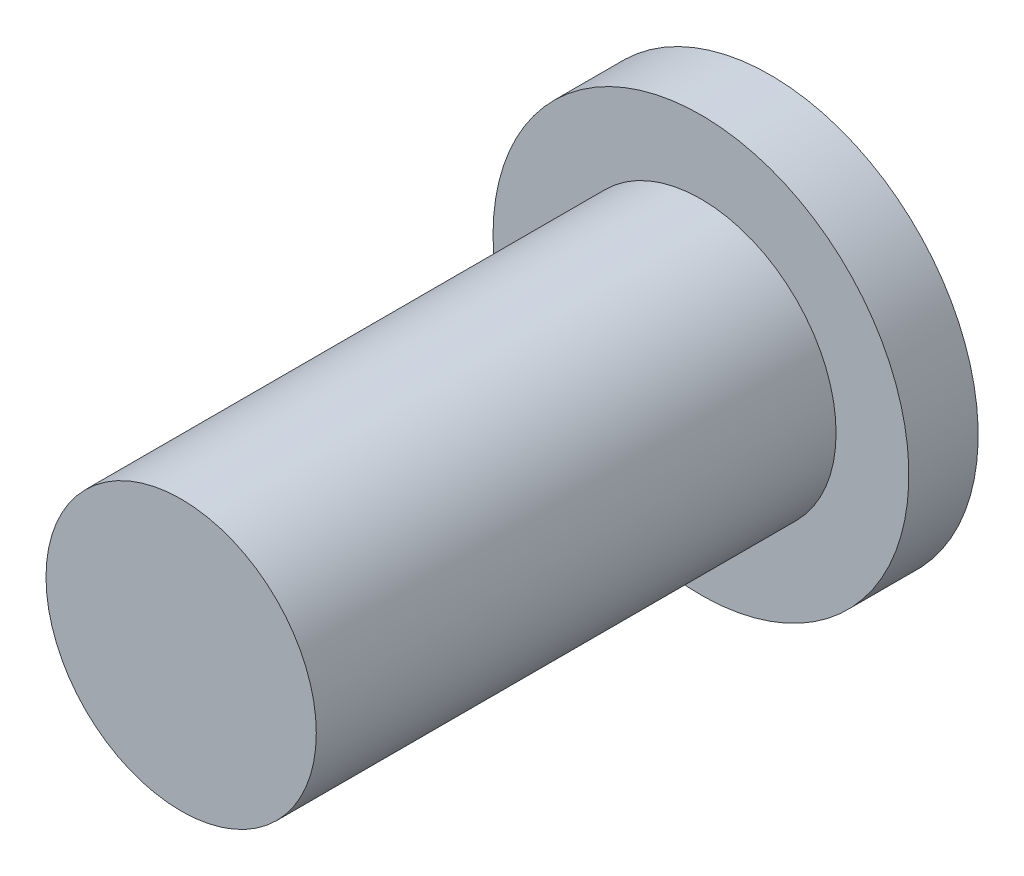
ISO-10303-21;
HEADER;
FILE_DESCRIPTION(('STEP AP214'),'2;1');
FILE_NAME('part.step','',(''),(''),'','','');
FILE_SCHEMA(('AUTOMOTIVE_DESIGN { 1 0 10303 214 1 1 1 1 }'));
ENDSEC;
DATA;
#1=APPLICATION_CONTEXT('core data for automotive mechanical design processes');
#2=APPLICATION_PROTOCOL_DEFINITION('international standard','automotive_design',2000,#1);
#3=PRODUCT_CONTEXT('',#1,'mechanical');
#4=PRODUCT('Part','Part','',(#3));
#5=PRODUCT_RELATED_PRODUCT_CATEGORY('part','',(#4));
#6=PRODUCT_DEFINITION_FORMATION('','',#4);
#7=PRODUCT_DEFINITION_CONTEXT('part definition',#1,'design');
#8=PRODUCT_DEFINITION('design','',#6,#7);
#9=PRODUCT_DEFINITION_SHAPE('','',#8);
#10=(LENGTH_UNIT() NAMED_UNIT(*) SI_UNIT(.MILLI.,.METRE.));
#11=(NAMED_UNIT(*) PLANE_ANGLE_UNIT() SI_UNIT($,.RADIAN.));
#12=(NAMED_UNIT(*) SI_UNIT($,.STERADIAN.) SOLID_ANGLE_UNIT());
#13=UNCERTAINTY_MEASURE_WITH_UNIT(LENGTH_MEASURE(1.E-05),#10,'distance_accuracy_value','');
#14=(GEOMETRIC_REPRESENTATION_CONTEXT(3) GLOBAL_UNCERTAINTY_ASSIGNED_CONTEXT((#13)) GLOBAL_UNIT_ASSIGNED_CONTEXT((#10,
#11,#12)) REPRESENTATION_CONTEXT('',''));
#15=CARTESIAN_POINT('',(0.,0.,0.));
#16=DIRECTION('',(0.,0.,1.));
#17=DIRECTION('',(1.,0.,0.));
#18=AXIS2_PLACEMENT_3D('',#15,#16,#17);
#19=CARTESIAN_POINT('',(0.,0.,15.));
#20=DIRECTION('',(0.,0.,-1.));
#21=DIRECTION('',(-1.,0.,0.));
#22=AXIS2_PLACEMENT_3D('',#19,#20,#21);
#23=CYLINDRICAL_SURFACE('',#22,3.9);
#24=CARTESIAN_POINT('',(0.,0.,15.));
#25=DIRECTION('',(0.,0.,1.));
#26=DIRECTION('',(1.,0.,0.));
#27=AXIS2_PLACEMENT_3D('',#24,#25,#26);
#28=CIRCLE('',#27,3.9);
#29=CARTESIAN_POINT('',(3.9,0.,15.));
#30=VERTEX_POINT('',#29);
#31=EDGE_CURVE('E10',#30,#30,#28,.T.);
#32=ORIENTED_EDGE('',*,*,#31,.F.);
#33=EDGE_LOOP('',(#32));
#34=FACE_BOUND('',#33,.T.);
#35=CARTESIAN_POINT('',(0.,0.,0.));
#36=DIRECTION('',(0.,0.,1.));
#37=DIRECTION('',(1.,0.,0.));
#38=AXIS2_PLACEMENT_3D('',#35,#36,#37);
#39=CIRCLE('',#38,3.9);
#40=CARTESIAN_POINT('',(3.9,0.,0.));
#41=VERTEX_POINT('',#40);
#42=EDGE_CURVE('E40',#41,#41,#39,.T.);
#43=ORIENTED_EDGE('',*,*,#42,.T.);
#44=EDGE_LOOP('',(#43));
#45=FACE_BOUND('',#44,.T.);
#46=ADVANCED_FACE('F37',(#34,#45),#23,.T.);
#47=CARTESIAN_POINT('',(0.,0.,15.));
#48=DIRECTION('',(0.,0.,1.));
#49=DIRECTION('',(1.,0.,0.));
#50=AXIS2_PLACEMENT_3D('',#47,#48,#49);
#51=PLANE('',#50);
#52=ORIENTED_EDGE('',*,*,#31,.T.);
#53=EDGE_LOOP('',(#52));
#54=FACE_BOUND('',#53,.T.);
#55=ADVANCED_FACE('F64',(#54),#51,.T.);
#56=CARTESIAN_POINT('',(0.,0.,-2.));
#57=DIRECTION('',(0.,0.,1.));
#58=DIRECTION('',(1.,0.,0.));
#59=AXIS2_PLACEMENT_3D('',#56,#57,#58);
#60=CYLINDRICAL_SURFACE('',#59,6.);
#61=CARTESIAN_POINT('',(0.,0.,-2.));
#62=DIRECTION('',(0.,0.,-1.));
#63=DIRECTION('',(-1.,0.,0.));
#64=AXIS2_PLACEMENT_3D('',#61,#62,#63);
#65=CIRCLE('',#64,6.);
#66=CARTESIAN_POINT('',(-6.,0.,-2.));
#67=VERTEX_POINT('',#66);
#68=EDGE_CURVE('E49',#67,#67,#65,.T.);
#69=ORIENTED_EDGE('',*,*,#68,.F.);
#70=EDGE_LOOP('',(#69));
#71=FACE_BOUND('',#70,.T.);
#72=CARTESIAN_POINT('',(0.,0.,0.));
#73=DIRECTION('',(0.,0.,-1.));
#74=DIRECTION('',(-1.,0.,0.));
#75=AXIS2_PLACEMENT_3D('',#72,#73,#74);
#76=CIRCLE('',#75,6.);
#77=CARTESIAN_POINT('',(-6.,0.,0.));
#78=VERTEX_POINT('',#77);
#79=EDGE_CURVE('E51',#78,#78,#76,.T.);
#80=ORIENTED_EDGE('',*,*,#79,.T.);
#81=EDGE_LOOP('',(#80));
#82=FACE_BOUND('',#81,.T.);
#83=ADVANCED_FACE('F61',(#71,#82),#60,.T.);
#84=CARTESIAN_POINT('',(0.,0.,-2.));
#85=DIRECTION('',(0.,0.,-1.));
#86=DIRECTION('',(-1.,0.,0.));
#87=AXIS2_PLACEMENT_3D('',#84,#85,#86);
#88=PLANE('',#87);
#89=ORIENTED_EDGE('',*,*,#68,.T.);
#90=EDGE_LOOP('',(#89));
#91=FACE_BOUND('',#90,.T.);
#92=ADVANCED_FACE('F59',(#91),#88,.T.);
#93=CARTESIAN_POINT('',(0.,0.,0.));
#94=DIRECTION('',(0.,0.,-1.));
#95=DIRECTION('',(-1.,0.,0.));
#96=AXIS2_PLACEMENT_3D('',#93,#94,#95);
#97=PLANE('',#96);
#98=ORIENTED_EDGE('',*,*,#42,.F.);
#99=EDGE_LOOP('',(#98));
#100=FACE_BOUND('',#99,.T.);
#101=ORIENTED_EDGE('',*,*,#79,.F.);
#102=EDGE_LOOP('',(#101));
#103=FACE_BOUND('',#102,.T.);
#104=ADVANCED_FACE('F68',(#100,#103),#97,.F.);
#105=CLOSED_SHELL('',(#46,#55,#83,#92,#104));
#106=MANIFOLD_SOLID_BREP('B2',#105);
#107=ADVANCED_BREP_SHAPE_REPRESENTATION('',(#18,#106),#14);
#108=SHAPE_DEFINITION_REPRESENTATION(#9,#107);
ENDSEC;
END-ISO-10303-21;
